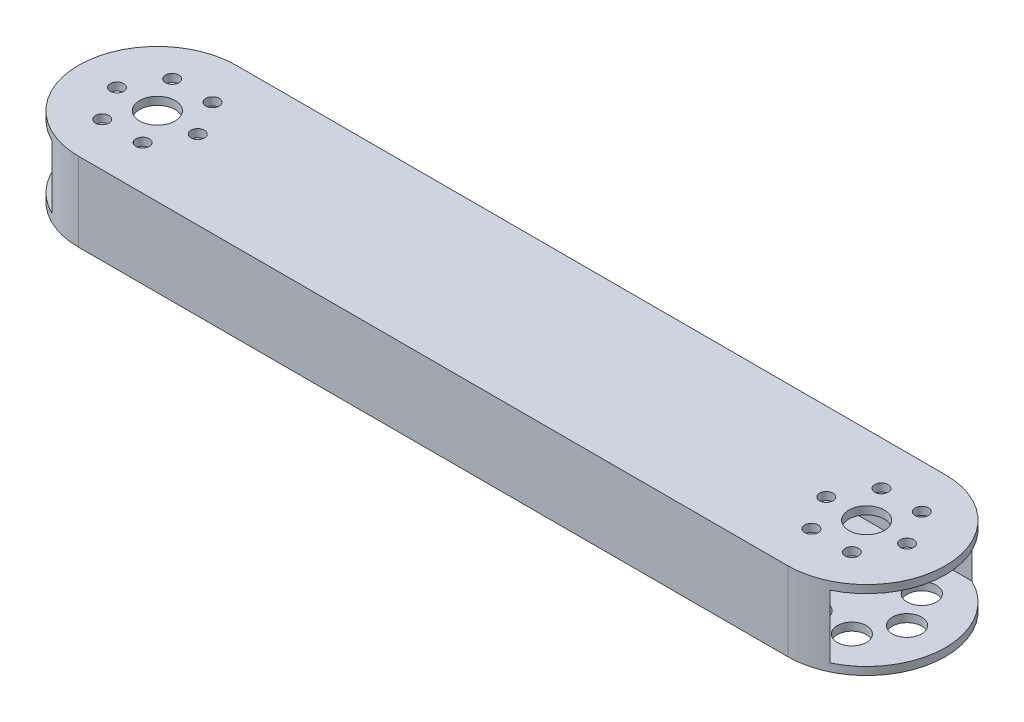
ISO-10303-21;
HEADER;
FILE_DESCRIPTION(('STEP AP214'),'2;1');
FILE_NAME('part.step','',(''),(''),'','','');
FILE_SCHEMA(('AUTOMOTIVE_DESIGN { 1 0 10303 214 1 1 1 1 }'));
ENDSEC;
DATA;
#1=APPLICATION_CONTEXT('core data for automotive mechanical design processes');
#2=APPLICATION_PROTOCOL_DEFINITION('international standard','automotive_design',2000,#1);
#3=PRODUCT_CONTEXT('',#1,'mechanical');
#4=PRODUCT('Part','Part','',(#3));
#5=PRODUCT_RELATED_PRODUCT_CATEGORY('part','',(#4));
#6=PRODUCT_DEFINITION_FORMATION('','',#4);
#7=PRODUCT_DEFINITION_CONTEXT('part definition',#1,'design');
#8=PRODUCT_DEFINITION('design','',#6,#7);
#9=PRODUCT_DEFINITION_SHAPE('','',#8);
#10=(LENGTH_UNIT() NAMED_UNIT(*) SI_UNIT(.MILLI.,.METRE.));
#11=(NAMED_UNIT(*) PLANE_ANGLE_UNIT() SI_UNIT($,.RADIAN.));
#12=(NAMED_UNIT(*) SI_UNIT($,.STERADIAN.) SOLID_ANGLE_UNIT());
#13=UNCERTAINTY_MEASURE_WITH_UNIT(LENGTH_MEASURE(1.E-05),#10,'distance_accuracy_value','');
#14=(GEOMETRIC_REPRESENTATION_CONTEXT(3) GLOBAL_UNCERTAINTY_ASSIGNED_CONTEXT((#13)) GLOBAL_UNIT_ASSIGNED_CONTEXT((#10,
#11,#12)) REPRESENTATION_CONTEXT('',''));
#15=CARTESIAN_POINT('',(0.,0.,0.));
#16=DIRECTION('',(0.,0.,1.));
#17=DIRECTION('',(1.,0.,0.));
#18=AXIS2_PLACEMENT_3D('',#15,#16,#17);
#19=CARTESIAN_POINT('',(220.,-10.,20.));
#20=DIRECTION('',(0.,1.,0.));
#21=DIRECTION('',(0.,0.,1.));
#22=AXIS2_PLACEMENT_3D('',#19,#20,#21);
#23=PLANE('',#22);
#24=CARTESIAN_POINT('',(14.875,-10.,-8.87676038879045));
#25=DIRECTION('',(0.,-1.,0.));
#26=DIRECTION('',(0.,0.,-1.));
#27=AXIS2_PLACEMENT_3D('',#24,#25,#26);
#28=CIRCLE('',#27,3.69999999999999);
#29=CARTESIAN_POINT('',(14.875,-10.,-12.5767603887905));
#30=VERTEX_POINT('',#29);
#31=EDGE_CURVE('E346',#30,#30,#28,.T.);
#32=ORIENTED_EDGE('',*,*,#31,.F.);
#33=EDGE_LOOP('',(#32));
#34=FACE_BOUND('',#33,.T.);
#35=CARTESIAN_POINT('',(25.125,-10.,-8.87676038879048));
#36=DIRECTION('',(0.,-1.,0.));
#37=DIRECTION('',(0.,0.,-1.));
#38=AXIS2_PLACEMENT_3D('',#35,#36,#37);
#39=CIRCLE('',#38,3.7);
#40=CARTESIAN_POINT('',(25.125,-10.,-12.5767603887905));
#41=VERTEX_POINT('',#40);
#42=EDGE_CURVE('E359',#41,#41,#39,.T.);
#43=ORIENTED_EDGE('',*,*,#42,.F.);
#44=EDGE_LOOP('',(#43));
#45=FACE_BOUND('',#44,.T.);
#46=CARTESIAN_POINT('',(30.25,-10.,0.));
#47=DIRECTION('',(0.,-1.,0.));
#48=DIRECTION('',(0.,0.,-1.));
#49=AXIS2_PLACEMENT_3D('',#46,#47,#48);
#50=CIRCLE('',#49,3.7);
#51=CARTESIAN_POINT('',(30.25,-10.,-3.7));
#52=VERTEX_POINT('',#51);
#53=EDGE_CURVE('E355',#52,#52,#50,.T.);
#54=ORIENTED_EDGE('',*,*,#53,.F.);
#55=EDGE_LOOP('',(#54));
#56=FACE_BOUND('',#55,.T.);
#57=CARTESIAN_POINT('',(194.875,-10.,8.87676038879051));
#58=DIRECTION('',(0.,-1.,0.));
#59=DIRECTION('',(0.,0.,-1.));
#60=AXIS2_PLACEMENT_3D('',#57,#58,#59);
#61=CIRCLE('',#60,3.70000000000007);
#62=CARTESIAN_POINT('',(194.875,-10.,5.17676038879044));
#63=VERTEX_POINT('',#62);
#64=EDGE_CURVE('E350',#63,#63,#61,.T.);
#65=ORIENTED_EDGE('',*,*,#64,.F.);
#66=EDGE_LOOP('',(#65));
#67=FACE_BOUND('',#66,.T.);
#68=CARTESIAN_POINT('',(205.125,-10.,8.87676038879048));
#69=DIRECTION('',(0.,-1.,0.));
#70=DIRECTION('',(0.,0.,-1.));
#71=AXIS2_PLACEMENT_3D('',#68,#69,#70);
#72=CIRCLE('',#71,3.70000000000004);
#73=CARTESIAN_POINT('',(205.125,-10.,5.17676038879044));
#74=VERTEX_POINT('',#73);
#75=EDGE_CURVE('E354',#74,#74,#72,.T.);
#76=ORIENTED_EDGE('',*,*,#75,.F.);
#77=EDGE_LOOP('',(#76));
#78=FACE_BOUND('',#77,.T.);
#79=CARTESIAN_POINT('',(210.25,-10.,0.));
#80=DIRECTION('',(0.,-1.,0.));
#81=DIRECTION('',(0.,0.,-1.));
#82=AXIS2_PLACEMENT_3D('',#79,#80,#81);
#83=CIRCLE('',#82,3.70000000000001);
#84=CARTESIAN_POINT('',(210.25,-10.,-3.7));
#85=VERTEX_POINT('',#84);
#86=EDGE_CURVE('E374',#85,#85,#83,.T.);
#87=ORIENTED_EDGE('',*,*,#86,.F.);
#88=EDGE_LOOP('',(#87));
#89=FACE_BOUND('',#88,.T.);
#90=CARTESIAN_POINT('',(205.125,-10.,-8.87676038879054));
#91=DIRECTION('',(0.,-1.,0.));
#92=DIRECTION('',(0.,0.,-1.));
#93=AXIS2_PLACEMENT_3D('',#90,#91,#92);
#94=CIRCLE('',#93,3.70000000000001);
#95=CARTESIAN_POINT('',(205.125,-10.,-12.5767603887905));
#96=VERTEX_POINT('',#95);
#97=EDGE_CURVE('E370',#96,#96,#94,.T.);
#98=ORIENTED_EDGE('',*,*,#97,.F.);
#99=EDGE_LOOP('',(#98));
#100=FACE_BOUND('',#99,.T.);
#101=CARTESIAN_POINT('',(194.875,-10.,-8.87676038879048));
#102=DIRECTION('',(0.,-1.,0.));
#103=DIRECTION('',(0.,0.,-1.));
#104=AXIS2_PLACEMENT_3D('',#101,#102,#103);
#105=CIRCLE('',#104,3.70000000000004);
#106=CARTESIAN_POINT('',(194.875,-10.,-12.5767603887905));
#107=VERTEX_POINT('',#106);
#108=EDGE_CURVE('E366',#107,#107,#105,.T.);
#109=ORIENTED_EDGE('',*,*,#108,.F.);
#110=EDGE_LOOP('',(#109));
#111=FACE_BOUND('',#110,.T.);
#112=CARTESIAN_POINT('',(14.875,-10.,8.87676038879054));
#113=DIRECTION('',(0.,-1.,0.));
#114=DIRECTION('',(0.,0.,-1.));
#115=AXIS2_PLACEMENT_3D('',#112,#113,#114);
#116=CIRCLE('',#115,3.70000000000001);
#117=CARTESIAN_POINT('',(14.875,-10.,5.17676038879053));
#118=VERTEX_POINT('',#117);
#119=EDGE_CURVE('E328',#118,#118,#116,.T.);
#120=ORIENTED_EDGE('',*,*,#119,.F.);
#121=EDGE_LOOP('',(#120));
#122=FACE_BOUND('',#121,.T.);
#123=CARTESIAN_POINT('',(25.125,-10.,8.87676038879051));
#124=DIRECTION('',(0.,-1.,0.));
#125=DIRECTION('',(0.,0.,-1.));
#126=AXIS2_PLACEMENT_3D('',#123,#124,#125);
#127=CIRCLE('',#126,3.7);
#128=CARTESIAN_POINT('',(25.125,-10.,5.17676038879051));
#129=VERTEX_POINT('',#128);
#130=EDGE_CURVE('E341',#129,#129,#127,.T.);
#131=ORIENTED_EDGE('',*,*,#130,.F.);
#132=EDGE_LOOP('',(#131));
#133=FACE_BOUND('',#132,.T.);
#134=CARTESIAN_POINT('',(9.75,-10.,0.));
#135=DIRECTION('',(0.,-1.,0.));
#136=DIRECTION('',(0.,0.,-1.));
#137=AXIS2_PLACEMENT_3D('',#134,#135,#136);
#138=CIRCLE('',#137,3.7);
#139=CARTESIAN_POINT('',(9.75,-10.,-3.69999999999995));
#140=VERTEX_POINT('',#139);
#141=EDGE_CURVE('E342',#140,#140,#138,.T.);
#142=ORIENTED_EDGE('',*,*,#141,.F.);
#143=EDGE_LOOP('',(#142));
#144=FACE_BOUND('',#143,.T.);
#145=CARTESIAN_POINT('',(189.75,-10.,0.));
#146=DIRECTION('',(0.,-1.,0.));
#147=DIRECTION('',(0.,0.,-1.));
#148=AXIS2_PLACEMENT_3D('',#145,#146,#147);
#149=CIRCLE('',#148,3.70000000000001);
#150=CARTESIAN_POINT('',(189.75,-10.,-3.70000000000001));
#151=VERTEX_POINT('',#150);
#152=EDGE_CURVE('E276',#151,#151,#149,.T.);
#153=ORIENTED_EDGE('',*,*,#152,.F.);
#154=EDGE_LOOP('',(#153));
#155=FACE_BOUND('',#154,.T.);
#156=DIRECTION('',(-1.,0.,0.));
#157=VECTOR('',#156,1.);
#158=CARTESIAN_POINT('',(220.,-10.,20.));
#159=LINE('',#158,#157);
#160=CARTESIAN_POINT('',(200.,-10.,20.));
#161=VERTEX_POINT('',#160);
#162=CARTESIAN_POINT('',(20.,-10.,20.));
#163=VERTEX_POINT('',#162);
#164=EDGE_CURVE('E251',#161,#163,#159,.T.);
#165=ORIENTED_EDGE('',*,*,#164,.T.);
#166=CARTESIAN_POINT('',(20.,-10.,0.));
#167=DIRECTION('',(0.,1.,0.));
#168=DIRECTION('',(0.,0.,1.));
#169=AXIS2_PLACEMENT_3D('',#166,#167,#168);
#170=CIRCLE('',#169,20.);
#171=CARTESIAN_POINT('',(20.,-10.,-20.));
#172=VERTEX_POINT('',#171);
#173=EDGE_CURVE('E233',#172,#163,#170,.T.);
#174=ORIENTED_EDGE('',*,*,#173,.F.);
#175=DIRECTION('',(-1.,0.,0.));
#176=VECTOR('',#175,1.);
#177=CARTESIAN_POINT('',(220.,-10.,-20.));
#178=LINE('',#177,#176);
#179=CARTESIAN_POINT('',(200.,-10.,-20.));
#180=VERTEX_POINT('',#179);
#181=EDGE_CURVE('E261',#180,#172,#178,.T.);
#182=ORIENTED_EDGE('',*,*,#181,.F.);
#183=CARTESIAN_POINT('',(200.,-10.,0.));
#184=DIRECTION('',(0.,1.,0.));
#185=DIRECTION('',(0.,0.,1.));
#186=AXIS2_PLACEMENT_3D('',#183,#184,#185);
#187=CIRCLE('',#186,20.);
#188=EDGE_CURVE('E259',#161,#180,#187,.T.);
#189=ORIENTED_EDGE('',*,*,#188,.F.);
#190=EDGE_LOOP('',(#165,#174,#182,#189));
#191=FACE_BOUND('',#190,.T.);
#192=ADVANCED_FACE('F165',(#34,#45,#56,#67,#78,#89,#100,#111,#122,#133,#144,#155,#191),#23,.F.);
#193=CARTESIAN_POINT('',(220.,10.,20.));
#194=DIRECTION('',(0.,1.,0.));
#195=DIRECTION('',(0.,0.,1.));
#196=AXIS2_PLACEMENT_3D('',#193,#194,#195);
#197=PLANE('',#196);
#198=CARTESIAN_POINT('',(20.,10.,0.));
#199=DIRECTION('',(0.,1.,0.));
#200=DIRECTION('',(0.,0.,1.));
#201=AXIS2_PLACEMENT_3D('',#198,#199,#200);
#202=CIRCLE('',#201,4.5);
#203=CARTESIAN_POINT('',(20.,10.,4.50000000000003));
#204=VERTEX_POINT('',#203);
#205=EDGE_CURVE('E322',#204,#204,#202,.T.);
#206=ORIENTED_EDGE('',*,*,#205,.F.);
#207=EDGE_LOOP('',(#206));
#208=FACE_BOUND('',#207,.T.);
#209=CARTESIAN_POINT('',(200.,10.,0.));
#210=DIRECTION('',(0.,1.,0.));
#211=DIRECTION('',(0.,0.,1.));
#212=AXIS2_PLACEMENT_3D('',#209,#210,#211);
#213=CIRCLE('',#212,4.49999999999999);
#214=CARTESIAN_POINT('',(200.,10.,4.5));
#215=VERTEX_POINT('',#214);
#216=EDGE_CURVE('E330',#215,#215,#213,.T.);
#217=ORIENTED_EDGE('',*,*,#216,.F.);
#218=EDGE_LOOP('',(#217));
#219=FACE_BOUND('',#218,.T.);
#220=CARTESIAN_POINT('',(194.875,10.,8.87676038879051));
#221=DIRECTION('',(0.,1.,0.));
#222=DIRECTION('',(0.,0.,1.));
#223=AXIS2_PLACEMENT_3D('',#220,#221,#222);
#224=CIRCLE('',#223,1.70000000000007);
#225=CARTESIAN_POINT('',(194.875,10.,10.5767603887906));
#226=VERTEX_POINT('',#225);
#227=EDGE_CURVE('E415',#226,#226,#224,.T.);
#228=ORIENTED_EDGE('',*,*,#227,.F.);
#229=EDGE_LOOP('',(#228));
#230=FACE_BOUND('',#229,.T.);
#231=CARTESIAN_POINT('',(14.875,10.,-8.87676038879045));
#232=DIRECTION('',(0.,1.,0.));
#233=DIRECTION('',(0.,0.,1.));
#234=AXIS2_PLACEMENT_3D('',#231,#232,#233);
#235=CIRCLE('',#234,1.7);
#236=CARTESIAN_POINT('',(14.875,10.,-7.17676038879046));
#237=VERTEX_POINT('',#236);
#238=EDGE_CURVE('E411',#237,#237,#235,.T.);
#239=ORIENTED_EDGE('',*,*,#238,.F.);
#240=EDGE_LOOP('',(#239));
#241=FACE_BOUND('',#240,.T.);
#242=CARTESIAN_POINT('',(25.125,10.,-8.87676038879048));
#243=DIRECTION('',(0.,1.,0.));
#244=DIRECTION('',(0.,0.,1.));
#245=AXIS2_PLACEMENT_3D('',#242,#243,#244);
#246=CIRCLE('',#245,1.7);
#247=CARTESIAN_POINT('',(25.125,10.,-7.17676038879048));
#248=VERTEX_POINT('',#247);
#249=EDGE_CURVE('E407',#248,#248,#246,.T.);
#250=ORIENTED_EDGE('',*,*,#249,.F.);
#251=EDGE_LOOP('',(#250));
#252=FACE_BOUND('',#251,.T.);
#253=CARTESIAN_POINT('',(30.25,10.,0.));
#254=DIRECTION('',(0.,1.,0.));
#255=DIRECTION('',(0.,0.,1.));
#256=AXIS2_PLACEMENT_3D('',#253,#254,#255);
#257=CIRCLE('',#256,1.7);
#258=CARTESIAN_POINT('',(30.25,10.,1.7));
#259=VERTEX_POINT('',#258);
#260=EDGE_CURVE('E399',#259,#259,#257,.T.);
#261=ORIENTED_EDGE('',*,*,#260,.F.);
#262=EDGE_LOOP('',(#261));
#263=FACE_BOUND('',#262,.T.);
#264=CARTESIAN_POINT('',(205.125,10.,-8.87676038879054));
#265=DIRECTION('',(0.,1.,0.));
#266=DIRECTION('',(0.,0.,1.));
#267=AXIS2_PLACEMENT_3D('',#264,#265,#266);
#268=CIRCLE('',#267,1.70000000000001);
#269=CARTESIAN_POINT('',(205.125,10.,-7.17676038879053));
#270=VERTEX_POINT('',#269);
#271=EDGE_CURVE('E431',#270,#270,#268,.T.);
#272=ORIENTED_EDGE('',*,*,#271,.F.);
#273=EDGE_LOOP('',(#272));
#274=FACE_BOUND('',#273,.T.);
#275=CARTESIAN_POINT('',(189.75,10.,0.));
#276=DIRECTION('',(0.,1.,0.));
#277=DIRECTION('',(0.,0.,1.));
#278=AXIS2_PLACEMENT_3D('',#275,#276,#277);
#279=CIRCLE('',#278,1.70000000000001);
#280=CARTESIAN_POINT('',(189.75,10.,1.70000000000002));
#281=VERTEX_POINT('',#280);
#282=EDGE_CURVE('E427',#281,#281,#279,.T.);
#283=ORIENTED_EDGE('',*,*,#282,.F.);
#284=EDGE_LOOP('',(#283));
#285=FACE_BOUND('',#284,.T.);
#286=CARTESIAN_POINT('',(210.25,10.,0.));
#287=DIRECTION('',(0.,1.,0.));
#288=DIRECTION('',(0.,0.,1.));
#289=AXIS2_PLACEMENT_3D('',#286,#287,#288);
#290=CIRCLE('',#289,1.70000000000001);
#291=CARTESIAN_POINT('',(210.25,10.,1.70000000000002));
#292=VERTEX_POINT('',#291);
#293=EDGE_CURVE('E423',#292,#292,#290,.T.);
#294=ORIENTED_EDGE('',*,*,#293,.F.);
#295=EDGE_LOOP('',(#294));
#296=FACE_BOUND('',#295,.T.);
#297=CARTESIAN_POINT('',(205.125,10.,8.87676038879048));
#298=DIRECTION('',(0.,1.,0.));
#299=DIRECTION('',(0.,0.,1.));
#300=AXIS2_PLACEMENT_3D('',#297,#298,#299);
#301=CIRCLE('',#300,1.70000000000004);
#302=CARTESIAN_POINT('',(205.125,10.,10.5767603887905));
#303=VERTEX_POINT('',#302);
#304=EDGE_CURVE('E419',#303,#303,#301,.T.);
#305=ORIENTED_EDGE('',*,*,#304,.F.);
#306=EDGE_LOOP('',(#305));
#307=FACE_BOUND('',#306,.T.);
#308=CARTESIAN_POINT('',(25.125,10.,8.87676038879051));
#309=DIRECTION('',(0.,1.,0.));
#310=DIRECTION('',(0.,0.,1.));
#311=AXIS2_PLACEMENT_3D('',#308,#309,#310);
#312=CIRCLE('',#311,1.7);
#313=CARTESIAN_POINT('',(25.125,10.,10.5767603887905));
#314=VERTEX_POINT('',#313);
#315=EDGE_CURVE('E395',#314,#314,#312,.T.);
#316=ORIENTED_EDGE('',*,*,#315,.F.);
#317=EDGE_LOOP('',(#316));
#318=FACE_BOUND('',#317,.T.);
#319=CARTESIAN_POINT('',(14.875,10.,8.87676038879054));
#320=DIRECTION('',(0.,1.,0.));
#321=DIRECTION('',(0.,0.,1.));
#322=AXIS2_PLACEMENT_3D('',#319,#320,#321);
#323=CIRCLE('',#322,1.7);
#324=CARTESIAN_POINT('',(14.875,10.,10.5767603887905));
#325=VERTEX_POINT('',#324);
#326=EDGE_CURVE('E400',#325,#325,#323,.T.);
#327=ORIENTED_EDGE('',*,*,#326,.F.);
#328=EDGE_LOOP('',(#327));
#329=FACE_BOUND('',#328,.T.);
#330=CARTESIAN_POINT('',(9.75,10.,0.));
#331=DIRECTION('',(0.,1.,0.));
#332=DIRECTION('',(0.,0.,1.));
#333=AXIS2_PLACEMENT_3D('',#330,#331,#332);
#334=CIRCLE('',#333,1.7);
#335=CARTESIAN_POINT('',(9.75,10.,1.70000000000005));
#336=VERTEX_POINT('',#335);
#337=EDGE_CURVE('E394',#336,#336,#334,.T.);
#338=ORIENTED_EDGE('',*,*,#337,.F.);
#339=EDGE_LOOP('',(#338));
#340=FACE_BOUND('',#339,.T.);
#341=CARTESIAN_POINT('',(194.875,10.,-8.87676038879048));
#342=DIRECTION('',(0.,1.,0.));
#343=DIRECTION('',(0.,0.,1.));
#344=AXIS2_PLACEMENT_3D('',#341,#342,#343);
#345=CIRCLE('',#344,1.70000000000004);
#346=CARTESIAN_POINT('',(194.875,10.,-7.17676038879044));
#347=VERTEX_POINT('',#346);
#348=EDGE_CURVE('E435',#347,#347,#345,.T.);
#349=ORIENTED_EDGE('',*,*,#348,.F.);
#350=EDGE_LOOP('',(#349));
#351=FACE_BOUND('',#350,.T.);
#352=CARTESIAN_POINT('',(20.,10.,0.));
#353=DIRECTION('',(0.,1.,0.));
#354=DIRECTION('',(0.,0.,1.));
#355=AXIS2_PLACEMENT_3D('',#352,#353,#354);
#356=CIRCLE('',#355,20.);
#357=CARTESIAN_POINT('',(20.,10.,-20.));
#358=VERTEX_POINT('',#357);
#359=CARTESIAN_POINT('',(20.,10.,20.));
#360=VERTEX_POINT('',#359);
#361=EDGE_CURVE('E246',#358,#360,#356,.T.);
#362=ORIENTED_EDGE('',*,*,#361,.T.);
#363=DIRECTION('',(-1.,0.,0.));
#364=VECTOR('',#363,1.);
#365=CARTESIAN_POINT('',(220.,10.,20.));
#366=LINE('',#365,#364);
#367=CARTESIAN_POINT('',(200.,10.,20.));
#368=VERTEX_POINT('',#367);
#369=EDGE_CURVE('E253',#368,#360,#366,.T.);
#370=ORIENTED_EDGE('',*,*,#369,.F.);
#371=CARTESIAN_POINT('',(200.,10.,0.));
#372=DIRECTION('',(0.,1.,0.));
#373=DIRECTION('',(0.,0.,1.));
#374=AXIS2_PLACEMENT_3D('',#371,#372,#373);
#375=CIRCLE('',#374,20.);
#376=CARTESIAN_POINT('',(200.,10.,-20.));
#377=VERTEX_POINT('',#376);
#378=EDGE_CURVE('E447',#368,#377,#375,.T.);
#379=ORIENTED_EDGE('',*,*,#378,.T.);
#380=DIRECTION('',(-1.,0.,0.));
#381=VECTOR('',#380,1.);
#382=CARTESIAN_POINT('',(220.,10.,-20.));
#383=LINE('',#382,#381);
#384=EDGE_CURVE('E267',#377,#358,#383,.T.);
#385=ORIENTED_EDGE('',*,*,#384,.T.);
#386=EDGE_LOOP('',(#362,#370,#379,#385));
#387=FACE_BOUND('',#386,.T.);
#388=ADVANCED_FACE('F530',(#208,#219,#230,#241,#252,#263,#274,#285,#296,#307,#318,#329,#340,
#351,#387),#197,.T.);
#389=CARTESIAN_POINT('',(220.,8.,0.));
#390=DIRECTION('',(0.,1.,0.));
#391=DIRECTION('',(0.,0.,1.));
#392=AXIS2_PLACEMENT_3D('',#389,#390,#391);
#393=PLANE('',#392);
#394=CARTESIAN_POINT('',(20.,8.,0.));
#395=DIRECTION('',(0.,1.,0.));
#396=DIRECTION('',(0.,0.,1.));
#397=AXIS2_PLACEMENT_3D('',#394,#395,#396);
#398=CIRCLE('',#397,4.5);
#399=CARTESIAN_POINT('',(20.,8.,4.50000000000003));
#400=VERTEX_POINT('',#399);
#401=EDGE_CURVE('E169',#400,#400,#398,.T.);
#402=ORIENTED_EDGE('',*,*,#401,.T.);
#403=EDGE_LOOP('',(#402));
#404=FACE_BOUND('',#403,.T.);
#405=CARTESIAN_POINT('',(200.,8.,0.));
#406=DIRECTION('',(0.,1.,0.));
#407=DIRECTION('',(0.,0.,1.));
#408=AXIS2_PLACEMENT_3D('',#405,#406,#407);
#409=CIRCLE('',#408,4.49999999999999);
#410=CARTESIAN_POINT('',(200.,8.,4.5));
#411=VERTEX_POINT('',#410);
#412=EDGE_CURVE('E319',#411,#411,#409,.T.);
#413=ORIENTED_EDGE('',*,*,#412,.T.);
#414=EDGE_LOOP('',(#413));
#415=FACE_BOUND('',#414,.T.);
#416=CARTESIAN_POINT('',(194.875,8.,8.87676038879051));
#417=DIRECTION('',(0.,1.,0.));
#418=DIRECTION('',(0.,0.,1.));
#419=AXIS2_PLACEMENT_3D('',#416,#417,#418);
#420=CIRCLE('',#419,1.70000000000007);
#421=CARTESIAN_POINT('',(194.875,8.,10.5767603887906));
#422=VERTEX_POINT('',#421);
#423=EDGE_CURVE('E509',#422,#422,#420,.T.);
#424=ORIENTED_EDGE('',*,*,#423,.T.);
#425=EDGE_LOOP('',(#424));
#426=FACE_BOUND('',#425,.T.);
#427=CARTESIAN_POINT('',(14.875,8.,-8.87676038879045));
#428=DIRECTION('',(0.,1.,0.));
#429=DIRECTION('',(0.,0.,1.));
#430=AXIS2_PLACEMENT_3D('',#427,#428,#429);
#431=CIRCLE('',#430,1.7);
#432=CARTESIAN_POINT('',(14.875,8.,-7.17676038879046));
#433=VERTEX_POINT('',#432);
#434=EDGE_CURVE('E505',#433,#433,#431,.T.);
#435=ORIENTED_EDGE('',*,*,#434,.T.);
#436=EDGE_LOOP('',(#435));
#437=FACE_BOUND('',#436,.T.);
#438=CARTESIAN_POINT('',(25.125,8.,-8.87676038879048));
#439=DIRECTION('',(0.,1.,0.));
#440=DIRECTION('',(0.,0.,1.));
#441=AXIS2_PLACEMENT_3D('',#438,#439,#440);
#442=CIRCLE('',#441,1.7);
#443=CARTESIAN_POINT('',(25.125,8.,-7.17676038879048));
#444=VERTEX_POINT('',#443);
#445=EDGE_CURVE('E501',#444,#444,#442,.T.);
#446=ORIENTED_EDGE('',*,*,#445,.T.);
#447=EDGE_LOOP('',(#446));
#448=FACE_BOUND('',#447,.T.);
#449=CARTESIAN_POINT('',(30.25,8.,0.));
#450=DIRECTION('',(0.,1.,0.));
#451=DIRECTION('',(0.,0.,1.));
#452=AXIS2_PLACEMENT_3D('',#449,#450,#451);
#453=CIRCLE('',#452,1.7);
#454=CARTESIAN_POINT('',(30.25,8.,1.7));
#455=VERTEX_POINT('',#454);
#456=EDGE_CURVE('E497',#455,#455,#453,.T.);
#457=ORIENTED_EDGE('',*,*,#456,.T.);
#458=EDGE_LOOP('',(#457));
#459=FACE_BOUND('',#458,.T.);
#460=CARTESIAN_POINT('',(205.125,8.,-8.87676038879054));
#461=DIRECTION('',(0.,1.,0.));
#462=DIRECTION('',(0.,0.,1.));
#463=AXIS2_PLACEMENT_3D('',#460,#461,#462);
#464=CIRCLE('',#463,1.70000000000001);
#465=CARTESIAN_POINT('',(205.125,8.,-7.17676038879053));
#466=VERTEX_POINT('',#465);
#467=EDGE_CURVE('E493',#466,#466,#464,.T.);
#468=ORIENTED_EDGE('',*,*,#467,.T.);
#469=EDGE_LOOP('',(#468));
#470=FACE_BOUND('',#469,.T.);
#471=CARTESIAN_POINT('',(189.75,8.,0.));
#472=DIRECTION('',(0.,1.,0.));
#473=DIRECTION('',(0.,0.,1.));
#474=AXIS2_PLACEMENT_3D('',#471,#472,#473);
#475=CIRCLE('',#474,1.70000000000001);
#476=CARTESIAN_POINT('',(189.75,8.,1.70000000000002));
#477=VERTEX_POINT('',#476);
#478=EDGE_CURVE('E489',#477,#477,#475,.T.);
#479=ORIENTED_EDGE('',*,*,#478,.T.);
#480=EDGE_LOOP('',(#479));
#481=FACE_BOUND('',#480,.T.);
#482=CARTESIAN_POINT('',(210.25,8.,0.));
#483=DIRECTION('',(0.,1.,0.));
#484=DIRECTION('',(0.,0.,1.));
#485=AXIS2_PLACEMENT_3D('',#482,#483,#484);
#486=CIRCLE('',#485,1.70000000000001);
#487=CARTESIAN_POINT('',(210.25,8.,1.70000000000002));
#488=VERTEX_POINT('',#487);
#489=EDGE_CURVE('E485',#488,#488,#486,.T.);
#490=ORIENTED_EDGE('',*,*,#489,.T.);
#491=EDGE_LOOP('',(#490));
#492=FACE_BOUND('',#491,.T.);
#493=CARTESIAN_POINT('',(205.125,8.,8.87676038879048));
#494=DIRECTION('',(0.,1.,0.));
#495=DIRECTION('',(0.,0.,1.));
#496=AXIS2_PLACEMENT_3D('',#493,#494,#495);
#497=CIRCLE('',#496,1.70000000000004);
#498=CARTESIAN_POINT('',(205.125,8.,10.5767603887905));
#499=VERTEX_POINT('',#498);
#500=EDGE_CURVE('E481',#499,#499,#497,.T.);
#501=ORIENTED_EDGE('',*,*,#500,.T.);
#502=EDGE_LOOP('',(#501));
#503=FACE_BOUND('',#502,.T.);
#504=CARTESIAN_POINT('',(25.125,8.,8.87676038879051));
#505=DIRECTION('',(0.,1.,0.));
#506=DIRECTION('',(0.,0.,1.));
#507=AXIS2_PLACEMENT_3D('',#504,#505,#506);
#508=CIRCLE('',#507,1.7);
#509=CARTESIAN_POINT('',(25.125,8.,10.5767603887905));
#510=VERTEX_POINT('',#509);
#511=EDGE_CURVE('E477',#510,#510,#508,.T.);
#512=ORIENTED_EDGE('',*,*,#511,.T.);
#513=EDGE_LOOP('',(#512));
#514=FACE_BOUND('',#513,.T.);
#515=CARTESIAN_POINT('',(14.875,8.,8.87676038879054));
#516=DIRECTION('',(0.,1.,0.));
#517=DIRECTION('',(0.,0.,1.));
#518=AXIS2_PLACEMENT_3D('',#515,#516,#517);
#519=CIRCLE('',#518,1.7);
#520=CARTESIAN_POINT('',(14.875,8.,10.5767603887905));
#521=VERTEX_POINT('',#520);
#522=EDGE_CURVE('E473',#521,#521,#519,.T.);
#523=ORIENTED_EDGE('',*,*,#522,.T.);
#524=EDGE_LOOP('',(#523));
#525=FACE_BOUND('',#524,.T.);
#526=CARTESIAN_POINT('',(9.75,8.,0.));
#527=DIRECTION('',(0.,1.,0.));
#528=DIRECTION('',(0.,0.,1.));
#529=AXIS2_PLACEMENT_3D('',#526,#527,#528);
#530=CIRCLE('',#529,1.7);
#531=CARTESIAN_POINT('',(9.75,8.,1.70000000000005));
#532=VERTEX_POINT('',#531);
#533=EDGE_CURVE('E469',#532,#532,#530,.T.);
#534=ORIENTED_EDGE('',*,*,#533,.T.);
#535=EDGE_LOOP('',(#534));
#536=FACE_BOUND('',#535,.T.);
#537=CARTESIAN_POINT('',(194.875,8.,-8.87676038879048));
#538=DIRECTION('',(0.,1.,0.));
#539=DIRECTION('',(0.,0.,1.));
#540=AXIS2_PLACEMENT_3D('',#537,#538,#539);
#541=CIRCLE('',#540,1.70000000000004);
#542=CARTESIAN_POINT('',(194.875,8.,-7.17676038879044));
#543=VERTEX_POINT('',#542);
#544=EDGE_CURVE('E465',#543,#543,#541,.T.);
#545=ORIENTED_EDGE('',*,*,#544,.T.);
#546=EDGE_LOOP('',(#545));
#547=FACE_BOUND('',#546,.T.);
#548=DIRECTION('',(-1.,0.,0.));
#549=VECTOR('',#548,1.);
#550=CARTESIAN_POINT('',(220.,8.,18.));
#551=LINE('',#550,#549);
#552=CARTESIAN_POINT('',(208.717797887081,8.,18.));
#553=VERTEX_POINT('',#552);
#554=CARTESIAN_POINT('',(11.2822021129186,8.,18.));
#555=VERTEX_POINT('',#554);
#556=EDGE_CURVE('E522',#553,#555,#551,.T.);
#557=ORIENTED_EDGE('',*,*,#556,.T.);
#558=CARTESIAN_POINT('',(20.,8.,0.));
#559=DIRECTION('',(0.,1.,0.));
#560=DIRECTION('',(0.,0.,1.));
#561=AXIS2_PLACEMENT_3D('',#558,#559,#560);
#562=CIRCLE('',#561,20.);
#563=CARTESIAN_POINT('',(11.2822021129187,8.,-18.));
#564=VERTEX_POINT('',#563);
#565=EDGE_CURVE('E457',#564,#555,#562,.T.);
#566=ORIENTED_EDGE('',*,*,#565,.F.);
#567=DIRECTION('',(-1.,0.,0.));
#568=VECTOR('',#567,1.);
#569=CARTESIAN_POINT('',(220.,8.,-18.));
#570=LINE('',#569,#568);
#571=CARTESIAN_POINT('',(208.717797887081,8.,-18.));
#572=VERTEX_POINT('',#571);
#573=EDGE_CURVE('E513',#572,#564,#570,.T.);
#574=ORIENTED_EDGE('',*,*,#573,.F.);
#575=CARTESIAN_POINT('',(200.,8.,0.));
#576=DIRECTION('',(0.,1.,0.));
#577=DIRECTION('',(0.,0.,1.));
#578=AXIS2_PLACEMENT_3D('',#575,#576,#577);
#579=CIRCLE('',#578,20.);
#580=EDGE_CURVE('E462',#553,#572,#579,.T.);
#581=ORIENTED_EDGE('',*,*,#580,.F.);
#582=EDGE_LOOP('',(#557,#566,#574,#581));
#583=FACE_BOUND('',#582,.T.);
#584=ADVANCED_FACE('F547',(#404,#415,#426,#437,#448,#459,#470,#481,#492,#503,#514,#525,#536,
#547,#583),#393,.F.);
#585=CARTESIAN_POINT('',(220.,0.,18.));
#586=DIRECTION('',(0.,0.,-1.));
#587=DIRECTION('',(-1.,0.,0.));
#588=AXIS2_PLACEMENT_3D('',#585,#586,#587);
#589=PLANE('',#588);
#590=DIRECTION('',(-1.,0.,0.));
#591=VECTOR('',#590,1.);
#592=CARTESIAN_POINT('',(220.,-8.,18.));
#593=LINE('',#592,#591);
#594=CARTESIAN_POINT('',(208.717797887081,-8.,18.));
#595=VERTEX_POINT('',#594);
#596=CARTESIAN_POINT('',(11.2822021129186,-8.,18.));
#597=VERTEX_POINT('',#596);
#598=EDGE_CURVE('E518',#595,#597,#593,.T.);
#599=ORIENTED_EDGE('',*,*,#598,.T.);
#600=DIRECTION('',(0.,1.,0.));
#601=VECTOR('',#600,1.);
#602=CARTESIAN_POINT('',(11.2822021129186,-10.,18.));
#603=LINE('',#602,#601);
#604=EDGE_CURVE('E390',#597,#555,#603,.T.);
#605=ORIENTED_EDGE('',*,*,#604,.T.);
#606=ORIENTED_EDGE('',*,*,#556,.F.);
#607=DIRECTION('',(0.,1.,0.));
#608=VECTOR('',#607,1.);
#609=CARTESIAN_POINT('',(208.717797887081,-10.,18.));
#610=LINE('',#609,#608);
#611=EDGE_CURVE('E190',#553,#595,#610,.F.);
#612=ORIENTED_EDGE('',*,*,#611,.T.);
#613=EDGE_LOOP('',(#599,#605,#606,#612));
#614=FACE_BOUND('',#613,.T.);
#615=ADVANCED_FACE('F550',(#614),#589,.T.);
#616=CARTESIAN_POINT('',(220.,-8.,0.));
#617=DIRECTION('',(0.,1.,0.));
#618=DIRECTION('',(0.,0.,1.));
#619=AXIS2_PLACEMENT_3D('',#616,#617,#618);
#620=PLANE('',#619);
#621=CARTESIAN_POINT('',(14.875,-8.,-8.87676038879045));
#622=DIRECTION('',(0.,1.,0.));
#623=DIRECTION('',(0.,0.,1.));
#624=AXIS2_PLACEMENT_3D('',#621,#622,#623);
#625=CIRCLE('',#624,3.69999999999999);
#626=CARTESIAN_POINT('',(14.875,-8.,-5.17676038879046));
#627=VERTEX_POINT('',#626);
#628=EDGE_CURVE('E316',#627,#627,#625,.T.);
#629=ORIENTED_EDGE('',*,*,#628,.F.);
#630=EDGE_LOOP('',(#629));
#631=FACE_BOUND('',#630,.T.);
#632=CARTESIAN_POINT('',(25.125,-8.,-8.87676038879048));
#633=DIRECTION('',(0.,1.,0.));
#634=DIRECTION('',(0.,0.,1.));
#635=AXIS2_PLACEMENT_3D('',#632,#633,#634);
#636=CIRCLE('',#635,3.7);
#637=CARTESIAN_POINT('',(25.125,-8.,-5.17676038879048));
#638=VERTEX_POINT('',#637);
#639=EDGE_CURVE('E312',#638,#638,#636,.T.);
#640=ORIENTED_EDGE('',*,*,#639,.F.);
#641=EDGE_LOOP('',(#640));
#642=FACE_BOUND('',#641,.T.);
#643=CARTESIAN_POINT('',(30.25,-8.,0.));
#644=DIRECTION('',(0.,1.,0.));
#645=DIRECTION('',(0.,0.,1.));
#646=AXIS2_PLACEMENT_3D('',#643,#644,#645);
#647=CIRCLE('',#646,3.7);
#648=CARTESIAN_POINT('',(30.25,-8.,3.7));
#649=VERTEX_POINT('',#648);
#650=EDGE_CURVE('E308',#649,#649,#647,.T.);
#651=ORIENTED_EDGE('',*,*,#650,.F.);
#652=EDGE_LOOP('',(#651));
#653=FACE_BOUND('',#652,.T.);
#654=CARTESIAN_POINT('',(194.875,-8.,8.87676038879051));
#655=DIRECTION('',(0.,1.,0.));
#656=DIRECTION('',(0.,0.,1.));
#657=AXIS2_PLACEMENT_3D('',#654,#655,#656);
#658=CIRCLE('',#657,3.70000000000007);
#659=CARTESIAN_POINT('',(194.875,-8.,12.5767603887906));
#660=VERTEX_POINT('',#659);
#661=EDGE_CURVE('E304',#660,#660,#658,.T.);
#662=ORIENTED_EDGE('',*,*,#661,.F.);
#663=EDGE_LOOP('',(#662));
#664=FACE_BOUND('',#663,.T.);
#665=CARTESIAN_POINT('',(205.125,-8.,8.87676038879048));
#666=DIRECTION('',(0.,1.,0.));
#667=DIRECTION('',(0.,0.,1.));
#668=AXIS2_PLACEMENT_3D('',#665,#666,#667);
#669=CIRCLE('',#668,3.70000000000004);
#670=CARTESIAN_POINT('',(205.125,-8.,12.5767603887905));
#671=VERTEX_POINT('',#670);
#672=EDGE_CURVE('E300',#671,#671,#669,.T.);
#673=ORIENTED_EDGE('',*,*,#672,.F.);
#674=EDGE_LOOP('',(#673));
#675=FACE_BOUND('',#674,.T.);
#676=CARTESIAN_POINT('',(210.25,-8.,0.));
#677=DIRECTION('',(0.,1.,0.));
#678=DIRECTION('',(0.,0.,1.));
#679=AXIS2_PLACEMENT_3D('',#676,#677,#678);
#680=CIRCLE('',#679,3.70000000000001);
#681=CARTESIAN_POINT('',(210.25,-8.,3.70000000000002));
#682=VERTEX_POINT('',#681);
#683=EDGE_CURVE('E296',#682,#682,#680,.T.);
#684=ORIENTED_EDGE('',*,*,#683,.F.);
#685=EDGE_LOOP('',(#684));
#686=FACE_BOUND('',#685,.T.);
#687=CARTESIAN_POINT('',(205.125,-8.,-8.87676038879054));
#688=DIRECTION('',(0.,1.,0.));
#689=DIRECTION('',(0.,0.,1.));
#690=AXIS2_PLACEMENT_3D('',#687,#688,#689);
#691=CIRCLE('',#690,3.70000000000001);
#692=CARTESIAN_POINT('',(205.125,-8.,-5.17676038879053));
#693=VERTEX_POINT('',#692);
#694=EDGE_CURVE('E292',#693,#693,#691,.T.);
#695=ORIENTED_EDGE('',*,*,#694,.F.);
#696=EDGE_LOOP('',(#695));
#697=FACE_BOUND('',#696,.T.);
#698=CARTESIAN_POINT('',(194.875,-8.,-8.87676038879048));
#699=DIRECTION('',(0.,1.,0.));
#700=DIRECTION('',(0.,0.,1.));
#701=AXIS2_PLACEMENT_3D('',#698,#699,#700);
#702=CIRCLE('',#701,3.70000000000004);
#703=CARTESIAN_POINT('',(194.875,-8.,-5.17676038879044));
#704=VERTEX_POINT('',#703);
#705=EDGE_CURVE('E288',#704,#704,#702,.T.);
#706=ORIENTED_EDGE('',*,*,#705,.F.);
#707=EDGE_LOOP('',(#706));
#708=FACE_BOUND('',#707,.T.);
#709=CARTESIAN_POINT('',(14.875,-8.,8.87676038879054));
#710=DIRECTION('',(0.,1.,0.));
#711=DIRECTION('',(0.,0.,1.));
#712=AXIS2_PLACEMENT_3D('',#709,#710,#711);
#713=CIRCLE('',#712,3.70000000000001);
#714=CARTESIAN_POINT('',(14.875,-8.,12.5767603887905));
#715=VERTEX_POINT('',#714);
#716=EDGE_CURVE('E284',#715,#715,#713,.T.);
#717=ORIENTED_EDGE('',*,*,#716,.F.);
#718=EDGE_LOOP('',(#717));
#719=FACE_BOUND('',#718,.T.);
#720=CARTESIAN_POINT('',(25.125,-8.,8.87676038879051));
#721=DIRECTION('',(0.,1.,0.));
#722=DIRECTION('',(0.,0.,1.));
#723=AXIS2_PLACEMENT_3D('',#720,#721,#722);
#724=CIRCLE('',#723,3.7);
#725=CARTESIAN_POINT('',(25.125,-8.,12.5767603887905));
#726=VERTEX_POINT('',#725);
#727=EDGE_CURVE('E280',#726,#726,#724,.T.);
#728=ORIENTED_EDGE('',*,*,#727,.F.);
#729=EDGE_LOOP('',(#728));
#730=FACE_BOUND('',#729,.T.);
#731=CARTESIAN_POINT('',(9.75,-8.,0.));
#732=DIRECTION('',(0.,1.,0.));
#733=DIRECTION('',(0.,0.,1.));
#734=AXIS2_PLACEMENT_3D('',#731,#732,#733);
#735=CIRCLE('',#734,3.7);
#736=CARTESIAN_POINT('',(9.75,-8.,3.70000000000005));
#737=VERTEX_POINT('',#736);
#738=EDGE_CURVE('E275',#737,#737,#735,.T.);
#739=ORIENTED_EDGE('',*,*,#738,.F.);
#740=EDGE_LOOP('',(#739));
#741=FACE_BOUND('',#740,.T.);
#742=CARTESIAN_POINT('',(189.75,-8.,0.));
#743=DIRECTION('',(0.,1.,0.));
#744=DIRECTION('',(0.,0.,1.));
#745=AXIS2_PLACEMENT_3D('',#742,#743,#744);
#746=CIRCLE('',#745,3.70000000000001);
#747=CARTESIAN_POINT('',(189.75,-8.,3.70000000000001));
#748=VERTEX_POINT('',#747);
#749=EDGE_CURVE('E271',#748,#748,#746,.T.);
#750=ORIENTED_EDGE('',*,*,#749,.F.);
#751=EDGE_LOOP('',(#750));
#752=FACE_BOUND('',#751,.T.);
#753=CARTESIAN_POINT('',(20.,-8.,0.));
#754=DIRECTION('',(0.,1.,0.));
#755=DIRECTION('',(0.,0.,1.));
#756=AXIS2_PLACEMENT_3D('',#753,#754,#755);
#757=CIRCLE('',#756,20.);
#758=CARTESIAN_POINT('',(11.2822021129187,-8.,-18.));
#759=VERTEX_POINT('',#758);
#760=EDGE_CURVE('E444',#759,#597,#757,.T.);
#761=ORIENTED_EDGE('',*,*,#760,.T.);
#762=ORIENTED_EDGE('',*,*,#598,.F.);
#763=CARTESIAN_POINT('',(200.,-8.,0.));
#764=DIRECTION('',(0.,1.,0.));
#765=DIRECTION('',(0.,0.,1.));
#766=AXIS2_PLACEMENT_3D('',#763,#764,#765);
#767=CIRCLE('',#766,20.);
#768=CARTESIAN_POINT('',(208.717797887081,-8.,-18.));
#769=VERTEX_POINT('',#768);
#770=EDGE_CURVE('E12',#595,#769,#767,.T.);
#771=ORIENTED_EDGE('',*,*,#770,.T.);
#772=DIRECTION('',(-1.,0.,0.));
#773=VECTOR('',#772,1.);
#774=CARTESIAN_POINT('',(220.,-8.,-18.));
#775=LINE('',#774,#773);
#776=EDGE_CURVE('E182',#769,#759,#775,.T.);
#777=ORIENTED_EDGE('',*,*,#776,.T.);
#778=EDGE_LOOP('',(#761,#762,#771,#777));
#779=FACE_BOUND('',#778,.T.);
#780=ADVANCED_FACE('F552',(#631,#642,#653,#664,#675,#686,#697,#708,#719,#730,#741,#752,#779),
#620,.T.);
#781=CARTESIAN_POINT('',(220.,0.,-18.));
#782=DIRECTION('',(0.,0.,-1.));
#783=DIRECTION('',(0.,1.,0.));
#784=AXIS2_PLACEMENT_3D('',#781,#782,#783);
#785=PLANE('',#784);
#786=DIRECTION('',(0.,1.,0.));
#787=VECTOR('',#786,1.);
#788=CARTESIAN_POINT('',(208.717797887081,-10.,-18.));
#789=LINE('',#788,#787);
#790=EDGE_CURVE('E255',#572,#769,#789,.F.);
#791=ORIENTED_EDGE('',*,*,#790,.F.);
#792=ORIENTED_EDGE('',*,*,#573,.T.);
#793=DIRECTION('',(0.,1.,0.));
#794=VECTOR('',#793,1.);
#795=CARTESIAN_POINT('',(11.2822021129187,-10.,-18.));
#796=LINE('',#795,#794);
#797=EDGE_CURVE('E175',#759,#564,#796,.T.);
#798=ORIENTED_EDGE('',*,*,#797,.F.);
#799=ORIENTED_EDGE('',*,*,#776,.F.);
#800=EDGE_LOOP('',(#791,#792,#798,#799));
#801=FACE_BOUND('',#800,.T.);
#802=ADVANCED_FACE('F544',(#801),#785,.F.);
#803=CARTESIAN_POINT('',(220.,10.,20.));
#804=DIRECTION('',(0.,0.,-1.));
#805=DIRECTION('',(0.,1.,0.));
#806=AXIS2_PLACEMENT_3D('',#803,#804,#805);
#807=PLANE('',#806);
#808=DIRECTION('',(0.,1.,0.));
#809=VECTOR('',#808,1.);
#810=CARTESIAN_POINT('',(20.,-10.,20.));
#811=LINE('',#810,#809);
#812=EDGE_CURVE('E238',#163,#360,#811,.T.);
#813=ORIENTED_EDGE('',*,*,#812,.F.);
#814=ORIENTED_EDGE('',*,*,#164,.F.);
#815=DIRECTION('',(0.,1.,0.));
#816=VECTOR('',#815,1.);
#817=CARTESIAN_POINT('',(200.,-10.,20.));
#818=LINE('',#817,#816);
#819=EDGE_CURVE('E441',#161,#368,#818,.T.);
#820=ORIENTED_EDGE('',*,*,#819,.T.);
#821=ORIENTED_EDGE('',*,*,#369,.T.);
#822=EDGE_LOOP('',(#813,#814,#820,#821));
#823=FACE_BOUND('',#822,.T.);
#824=ADVANCED_FACE('F167',(#823),#807,.F.);
#825=CARTESIAN_POINT('',(220.,10.,-20.));
#826=DIRECTION('',(0.,0.,-1.));
#827=DIRECTION('',(0.,1.,0.));
#828=AXIS2_PLACEMENT_3D('',#825,#826,#827);
#829=PLANE('',#828);
#830=DIRECTION('',(0.,1.,0.));
#831=VECTOR('',#830,1.);
#832=CARTESIAN_POINT('',(200.,-10.,-20.));
#833=LINE('',#832,#831);
#834=EDGE_CURVE('E256',#180,#377,#833,.T.);
#835=ORIENTED_EDGE('',*,*,#834,.F.);
#836=ORIENTED_EDGE('',*,*,#181,.T.);
#837=DIRECTION('',(0.,1.,0.));
#838=VECTOR('',#837,1.);
#839=CARTESIAN_POINT('',(20.,-10.,-20.));
#840=LINE('',#839,#838);
#841=EDGE_CURVE('E241',#172,#358,#840,.T.);
#842=ORIENTED_EDGE('',*,*,#841,.T.);
#843=ORIENTED_EDGE('',*,*,#384,.F.);
#844=EDGE_LOOP('',(#835,#836,#842,#843));
#845=FACE_BOUND('',#844,.T.);
#846=ADVANCED_FACE('F533',(#845),#829,.T.);
#847=CARTESIAN_POINT('',(20.,-10.,0.));
#848=DIRECTION('',(0.,1.,0.));
#849=DIRECTION('',(0.,0.,1.));
#850=AXIS2_PLACEMENT_3D('',#847,#848,#849);
#851=CYLINDRICAL_SURFACE('',#850,20.);
#852=ORIENTED_EDGE('',*,*,#812,.T.);
#853=ORIENTED_EDGE('',*,*,#361,.F.);
#854=ORIENTED_EDGE('',*,*,#841,.F.);
#855=ORIENTED_EDGE('',*,*,#173,.T.);
#856=EDGE_LOOP('',(#852,#853,#854,#855));
#857=FACE_BOUND('',#856,.T.);
#858=ORIENTED_EDGE('',*,*,#565,.T.);
#859=ORIENTED_EDGE('',*,*,#604,.F.);
#860=ORIENTED_EDGE('',*,*,#760,.F.);
#861=ORIENTED_EDGE('',*,*,#797,.T.);
#862=EDGE_LOOP('',(#858,#859,#860,#861));
#863=FACE_BOUND('',#862,.T.);
#864=ADVANCED_FACE('F235',(#857,#863),#851,.T.);
#865=CARTESIAN_POINT('',(200.,-10.,0.));
#866=DIRECTION('',(0.,1.,0.));
#867=DIRECTION('',(0.,0.,1.));
#868=AXIS2_PLACEMENT_3D('',#865,#866,#867);
#869=CYLINDRICAL_SURFACE('',#868,20.);
#870=ORIENTED_EDGE('',*,*,#834,.T.);
#871=ORIENTED_EDGE('',*,*,#378,.F.);
#872=ORIENTED_EDGE('',*,*,#819,.F.);
#873=ORIENTED_EDGE('',*,*,#188,.T.);
#874=EDGE_LOOP('',(#870,#871,#872,#873));
#875=FACE_BOUND('',#874,.T.);
#876=ORIENTED_EDGE('',*,*,#580,.T.);
#877=ORIENTED_EDGE('',*,*,#790,.T.);
#878=ORIENTED_EDGE('',*,*,#770,.F.);
#879=ORIENTED_EDGE('',*,*,#611,.F.);
#880=EDGE_LOOP('',(#876,#877,#878,#879));
#881=FACE_BOUND('',#880,.T.);
#882=ADVANCED_FACE('F535',(#875,#881),#869,.T.);
#883=CARTESIAN_POINT('',(194.875,-10.,-8.87676038879048));
#884=DIRECTION('',(0.,1.,0.));
#885=DIRECTION('',(0.,0.,1.));
#886=AXIS2_PLACEMENT_3D('',#883,#884,#885);
#887=CYLINDRICAL_SURFACE('',#886,1.70000000000004);
#888=ORIENTED_EDGE('',*,*,#348,.T.);
#889=EDGE_LOOP('',(#888));
#890=FACE_BOUND('',#889,.T.);
#891=ORIENTED_EDGE('',*,*,#544,.F.);
#892=EDGE_LOOP('',(#891));
#893=FACE_BOUND('',#892,.T.);
#894=ADVANCED_FACE('F537',(#890,#893),#887,.F.);
#895=CARTESIAN_POINT('',(9.75,-10.,0.));
#896=DIRECTION('',(0.,1.,0.));
#897=DIRECTION('',(0.,0.,1.));
#898=AXIS2_PLACEMENT_3D('',#895,#896,#897);
#899=CYLINDRICAL_SURFACE('',#898,1.7);
#900=ORIENTED_EDGE('',*,*,#337,.T.);
#901=EDGE_LOOP('',(#900));
#902=FACE_BOUND('',#901,.T.);
#903=ORIENTED_EDGE('',*,*,#533,.F.);
#904=EDGE_LOOP('',(#903));
#905=FACE_BOUND('',#904,.T.);
#906=ADVANCED_FACE('F610',(#902,#905),#899,.F.);
#907=CARTESIAN_POINT('',(14.875,-10.,8.87676038879054));
#908=DIRECTION('',(0.,1.,0.));
#909=DIRECTION('',(0.,0.,1.));
#910=AXIS2_PLACEMENT_3D('',#907,#908,#909);
#911=CYLINDRICAL_SURFACE('',#910,1.7);
#912=ORIENTED_EDGE('',*,*,#326,.T.);
#913=EDGE_LOOP('',(#912));
#914=FACE_BOUND('',#913,.T.);
#915=ORIENTED_EDGE('',*,*,#522,.F.);
#916=EDGE_LOOP('',(#915));
#917=FACE_BOUND('',#916,.T.);
#918=ADVANCED_FACE('F616',(#914,#917),#911,.F.);
#919=CARTESIAN_POINT('',(25.125,-10.,8.87676038879051));
#920=DIRECTION('',(0.,1.,0.));
#921=DIRECTION('',(0.,0.,1.));
#922=AXIS2_PLACEMENT_3D('',#919,#920,#921);
#923=CYLINDRICAL_SURFACE('',#922,1.7);
#924=ORIENTED_EDGE('',*,*,#315,.T.);
#925=EDGE_LOOP('',(#924));
#926=FACE_BOUND('',#925,.T.);
#927=ORIENTED_EDGE('',*,*,#511,.F.);
#928=EDGE_LOOP('',(#927));
#929=FACE_BOUND('',#928,.T.);
#930=ADVANCED_FACE('F635',(#926,#929),#923,.F.);
#931=CARTESIAN_POINT('',(205.125,-10.,8.87676038879048));
#932=DIRECTION('',(0.,1.,0.));
#933=DIRECTION('',(0.,0.,1.));
#934=AXIS2_PLACEMENT_3D('',#931,#932,#933);
#935=CYLINDRICAL_SURFACE('',#934,1.70000000000004);
#936=ORIENTED_EDGE('',*,*,#304,.T.);
#937=EDGE_LOOP('',(#936));
#938=FACE_BOUND('',#937,.T.);
#939=ORIENTED_EDGE('',*,*,#500,.F.);
#940=EDGE_LOOP('',(#939));
#941=FACE_BOUND('',#940,.T.);
#942=ADVANCED_FACE('F632',(#938,#941),#935,.F.);
#943=CARTESIAN_POINT('',(210.25,-10.,0.));
#944=DIRECTION('',(0.,1.,0.));
#945=DIRECTION('',(0.,0.,1.));
#946=AXIS2_PLACEMENT_3D('',#943,#944,#945);
#947=CYLINDRICAL_SURFACE('',#946,1.70000000000001);
#948=ORIENTED_EDGE('',*,*,#293,.T.);
#949=EDGE_LOOP('',(#948));
#950=FACE_BOUND('',#949,.T.);
#951=ORIENTED_EDGE('',*,*,#489,.F.);
#952=EDGE_LOOP('',(#951));
#953=FACE_BOUND('',#952,.T.);
#954=ADVANCED_FACE('F626',(#950,#953),#947,.F.);
#955=CARTESIAN_POINT('',(189.75,-10.,0.));
#956=DIRECTION('',(0.,1.,0.));
#957=DIRECTION('',(0.,0.,1.));
#958=AXIS2_PLACEMENT_3D('',#955,#956,#957);
#959=CYLINDRICAL_SURFACE('',#958,1.70000000000001);
#960=ORIENTED_EDGE('',*,*,#282,.T.);
#961=EDGE_LOOP('',(#960));
#962=FACE_BOUND('',#961,.T.);
#963=ORIENTED_EDGE('',*,*,#478,.F.);
#964=EDGE_LOOP('',(#963));
#965=FACE_BOUND('',#964,.T.);
#966=ADVANCED_FACE('F622',(#962,#965),#959,.F.);
#967=CARTESIAN_POINT('',(205.125,-10.,-8.87676038879054));
#968=DIRECTION('',(0.,1.,0.));
#969=DIRECTION('',(0.,0.,1.));
#970=AXIS2_PLACEMENT_3D('',#967,#968,#969);
#971=CYLINDRICAL_SURFACE('',#970,1.70000000000001);
#972=ORIENTED_EDGE('',*,*,#271,.T.);
#973=EDGE_LOOP('',(#972));
#974=FACE_BOUND('',#973,.T.);
#975=ORIENTED_EDGE('',*,*,#467,.F.);
#976=EDGE_LOOP('',(#975));
#977=FACE_BOUND('',#976,.T.);
#978=ADVANCED_FACE('F625',(#974,#977),#971,.F.);
#979=CARTESIAN_POINT('',(30.25,-10.,0.));
#980=DIRECTION('',(0.,1.,0.));
#981=DIRECTION('',(0.,0.,1.));
#982=AXIS2_PLACEMENT_3D('',#979,#980,#981);
#983=CYLINDRICAL_SURFACE('',#982,1.7);
#984=ORIENTED_EDGE('',*,*,#260,.T.);
#985=EDGE_LOOP('',(#984));
#986=FACE_BOUND('',#985,.T.);
#987=ORIENTED_EDGE('',*,*,#456,.F.);
#988=EDGE_LOOP('',(#987));
#989=FACE_BOUND('',#988,.T.);
#990=ADVANCED_FACE('F630',(#986,#989),#983,.F.);
#991=CARTESIAN_POINT('',(25.125,-10.,-8.87676038879048));
#992=DIRECTION('',(0.,1.,0.));
#993=DIRECTION('',(0.,0.,1.));
#994=AXIS2_PLACEMENT_3D('',#991,#992,#993);
#995=CYLINDRICAL_SURFACE('',#994,1.7);
#996=ORIENTED_EDGE('',*,*,#249,.T.);
#997=EDGE_LOOP('',(#996));
#998=FACE_BOUND('',#997,.T.);
#999=ORIENTED_EDGE('',*,*,#445,.F.);
#1000=EDGE_LOOP('',(#999));
#1001=FACE_BOUND('',#1000,.T.);
#1002=ADVANCED_FACE('F644',(#998,#1001),#995,.F.);
#1003=CARTESIAN_POINT('',(14.875,-10.,-8.87676038879045));
#1004=DIRECTION('',(0.,1.,0.));
#1005=DIRECTION('',(0.,0.,1.));
#1006=AXIS2_PLACEMENT_3D('',#1003,#1004,#1005);
#1007=CYLINDRICAL_SURFACE('',#1006,1.7);
#1008=ORIENTED_EDGE('',*,*,#238,.T.);
#1009=EDGE_LOOP('',(#1008));
#1010=FACE_BOUND('',#1009,.T.);
#1011=ORIENTED_EDGE('',*,*,#434,.F.);
#1012=EDGE_LOOP('',(#1011));
#1013=FACE_BOUND('',#1012,.T.);
#1014=ADVANCED_FACE('F640',(#1010,#1013),#1007,.F.);
#1015=CARTESIAN_POINT('',(194.875,-10.,8.87676038879051));
#1016=DIRECTION('',(0.,1.,0.));
#1017=DIRECTION('',(0.,0.,1.));
#1018=AXIS2_PLACEMENT_3D('',#1015,#1016,#1017);
#1019=CYLINDRICAL_SURFACE('',#1018,1.70000000000007);
#1020=ORIENTED_EDGE('',*,*,#227,.T.);
#1021=EDGE_LOOP('',(#1020));
#1022=FACE_BOUND('',#1021,.T.);
#1023=ORIENTED_EDGE('',*,*,#423,.F.);
#1024=EDGE_LOOP('',(#1023));
#1025=FACE_BOUND('',#1024,.T.);
#1026=ADVANCED_FACE('F643',(#1022,#1025),#1019,.F.);
#1027=CARTESIAN_POINT('',(189.75,-5.,0.));
#1028=DIRECTION('',(0.,-1.,0.));
#1029=DIRECTION('',(0.,0.,-1.));
#1030=AXIS2_PLACEMENT_3D('',#1027,#1028,#1029);
#1031=CYLINDRICAL_SURFACE('',#1030,3.70000000000001);
#1032=ORIENTED_EDGE('',*,*,#749,.T.);
#1033=EDGE_LOOP('',(#1032));
#1034=FACE_BOUND('',#1033,.T.);
#1035=ORIENTED_EDGE('',*,*,#152,.T.);
#1036=EDGE_LOOP('',(#1035));
#1037=FACE_BOUND('',#1036,.T.);
#1038=ADVANCED_FACE('F647',(#1034,#1037),#1031,.F.);
#1039=CARTESIAN_POINT('',(9.75,-5.,0.));
#1040=DIRECTION('',(0.,-1.,0.));
#1041=DIRECTION('',(0.,0.,-1.));
#1042=AXIS2_PLACEMENT_3D('',#1039,#1040,#1041);
#1043=CYLINDRICAL_SURFACE('',#1042,3.7);
#1044=ORIENTED_EDGE('',*,*,#738,.T.);
#1045=EDGE_LOOP('',(#1044));
#1046=FACE_BOUND('',#1045,.T.);
#1047=ORIENTED_EDGE('',*,*,#141,.T.);
#1048=EDGE_LOOP('',(#1047));
#1049=FACE_BOUND('',#1048,.T.);
#1050=ADVANCED_FACE('F662',(#1046,#1049),#1043,.F.);
#1051=CARTESIAN_POINT('',(25.125,-5.,8.87676038879051));
#1052=DIRECTION('',(0.,-1.,0.));
#1053=DIRECTION('',(0.,0.,-1.));
#1054=AXIS2_PLACEMENT_3D('',#1051,#1052,#1053);
#1055=CYLINDRICAL_SURFACE('',#1054,3.7);
#1056=ORIENTED_EDGE('',*,*,#727,.T.);
#1057=EDGE_LOOP('',(#1056));
#1058=FACE_BOUND('',#1057,.T.);
#1059=ORIENTED_EDGE('',*,*,#130,.T.);
#1060=EDGE_LOOP('',(#1059));
#1061=FACE_BOUND('',#1060,.T.);
#1062=ADVANCED_FACE('F698',(#1058,#1061),#1055,.F.);
#1063=CARTESIAN_POINT('',(14.875,-5.,8.87676038879054));
#1064=DIRECTION('',(0.,-1.,0.));
#1065=DIRECTION('',(0.,0.,-1.));
#1066=AXIS2_PLACEMENT_3D('',#1063,#1064,#1065);
#1067=CYLINDRICAL_SURFACE('',#1066,3.70000000000001);
#1068=ORIENTED_EDGE('',*,*,#716,.T.);
#1069=EDGE_LOOP('',(#1068));
#1070=FACE_BOUND('',#1069,.T.);
#1071=ORIENTED_EDGE('',*,*,#119,.T.);
#1072=EDGE_LOOP('',(#1071));
#1073=FACE_BOUND('',#1072,.T.);
#1074=ADVANCED_FACE('F680',(#1070,#1073),#1067,.F.);
#1075=CARTESIAN_POINT('',(194.875,-5.,-8.87676038879048));
#1076=DIRECTION('',(0.,-1.,0.));
#1077=DIRECTION('',(0.,0.,-1.));
#1078=AXIS2_PLACEMENT_3D('',#1075,#1076,#1077);
#1079=CYLINDRICAL_SURFACE('',#1078,3.70000000000004);
#1080=ORIENTED_EDGE('',*,*,#705,.T.);
#1081=EDGE_LOOP('',(#1080));
#1082=FACE_BOUND('',#1081,.T.);
#1083=ORIENTED_EDGE('',*,*,#108,.T.);
#1084=EDGE_LOOP('',(#1083));
#1085=FACE_BOUND('',#1084,.T.);
#1086=ADVANCED_FACE('F676',(#1082,#1085),#1079,.F.);
#1087=CARTESIAN_POINT('',(205.125,-5.,-8.87676038879054));
#1088=DIRECTION('',(0.,-1.,0.));
#1089=DIRECTION('',(0.,0.,-1.));
#1090=AXIS2_PLACEMENT_3D('',#1087,#1088,#1089);
#1091=CYLINDRICAL_SURFACE('',#1090,3.70000000000001);
#1092=ORIENTED_EDGE('',*,*,#694,.T.);
#1093=EDGE_LOOP('',(#1092));
#1094=FACE_BOUND('',#1093,.T.);
#1095=ORIENTED_EDGE('',*,*,#97,.T.);
#1096=EDGE_LOOP('',(#1095));
#1097=FACE_BOUND('',#1096,.T.);
#1098=ADVANCED_FACE('F672',(#1094,#1097),#1091,.F.);
#1099=CARTESIAN_POINT('',(210.25,-5.,0.));
#1100=DIRECTION('',(0.,-1.,0.));
#1101=DIRECTION('',(0.,0.,-1.));
#1102=AXIS2_PLACEMENT_3D('',#1099,#1100,#1101);
#1103=CYLINDRICAL_SURFACE('',#1102,3.70000000000001);
#1104=ORIENTED_EDGE('',*,*,#683,.T.);
#1105=EDGE_LOOP('',(#1104));
#1106=FACE_BOUND('',#1105,.T.);
#1107=ORIENTED_EDGE('',*,*,#86,.T.);
#1108=EDGE_LOOP('',(#1107));
#1109=FACE_BOUND('',#1108,.T.);
#1110=ADVANCED_FACE('F668',(#1106,#1109),#1103,.F.);
#1111=CARTESIAN_POINT('',(205.125,-5.,8.87676038879048));
#1112=DIRECTION('',(0.,-1.,0.));
#1113=DIRECTION('',(0.,0.,-1.));
#1114=AXIS2_PLACEMENT_3D('',#1111,#1112,#1113);
#1115=CYLINDRICAL_SURFACE('',#1114,3.70000000000004);
#1116=ORIENTED_EDGE('',*,*,#672,.T.);
#1117=EDGE_LOOP('',(#1116));
#1118=FACE_BOUND('',#1117,.T.);
#1119=ORIENTED_EDGE('',*,*,#75,.T.);
#1120=EDGE_LOOP('',(#1119));
#1121=FACE_BOUND('',#1120,.T.);
#1122=ADVANCED_FACE('F664',(#1118,#1121),#1115,.F.);
#1123=CARTESIAN_POINT('',(194.875,-5.,8.87676038879051));
#1124=DIRECTION('',(0.,-1.,0.));
#1125=DIRECTION('',(0.,0.,-1.));
#1126=AXIS2_PLACEMENT_3D('',#1123,#1124,#1125);
#1127=CYLINDRICAL_SURFACE('',#1126,3.70000000000007);
#1128=ORIENTED_EDGE('',*,*,#661,.T.);
#1129=EDGE_LOOP('',(#1128));
#1130=FACE_BOUND('',#1129,.T.);
#1131=ORIENTED_EDGE('',*,*,#64,.T.);
#1132=EDGE_LOOP('',(#1131));
#1133=FACE_BOUND('',#1132,.T.);
#1134=ADVANCED_FACE('F667',(#1130,#1133),#1127,.F.);
#1135=CARTESIAN_POINT('',(30.25,-5.,0.));
#1136=DIRECTION('',(0.,-1.,0.));
#1137=DIRECTION('',(0.,0.,-1.));
#1138=AXIS2_PLACEMENT_3D('',#1135,#1136,#1137);
#1139=CYLINDRICAL_SURFACE('',#1138,3.7);
#1140=ORIENTED_EDGE('',*,*,#650,.T.);
#1141=EDGE_LOOP('',(#1140));
#1142=FACE_BOUND('',#1141,.T.);
#1143=ORIENTED_EDGE('',*,*,#53,.T.);
#1144=EDGE_LOOP('',(#1143));
#1145=FACE_BOUND('',#1144,.T.);
#1146=ADVANCED_FACE('F690',(#1142,#1145),#1139,.F.);
#1147=CARTESIAN_POINT('',(25.125,-5.,-8.87676038879048));
#1148=DIRECTION('',(0.,-1.,0.));
#1149=DIRECTION('',(0.,0.,-1.));
#1150=AXIS2_PLACEMENT_3D('',#1147,#1148,#1149);
#1151=CYLINDRICAL_SURFACE('',#1150,3.7);
#1152=ORIENTED_EDGE('',*,*,#639,.T.);
#1153=EDGE_LOOP('',(#1152));
#1154=FACE_BOUND('',#1153,.T.);
#1155=ORIENTED_EDGE('',*,*,#42,.T.);
#1156=EDGE_LOOP('',(#1155));
#1157=FACE_BOUND('',#1156,.T.);
#1158=ADVANCED_FACE('F686',(#1154,#1157),#1151,.F.);
#1159=CARTESIAN_POINT('',(14.875,-5.,-8.87676038879045));
#1160=DIRECTION('',(0.,-1.,0.));
#1161=DIRECTION('',(0.,0.,-1.));
#1162=AXIS2_PLACEMENT_3D('',#1159,#1160,#1161);
#1163=CYLINDRICAL_SURFACE('',#1162,3.69999999999999);
#1164=ORIENTED_EDGE('',*,*,#628,.T.);
#1165=EDGE_LOOP('',(#1164));
#1166=FACE_BOUND('',#1165,.T.);
#1167=ORIENTED_EDGE('',*,*,#31,.T.);
#1168=EDGE_LOOP('',(#1167));
#1169=FACE_BOUND('',#1168,.T.);
#1170=ADVANCED_FACE('F682',(#1166,#1169),#1163,.F.);
#1171=CARTESIAN_POINT('',(200.,5.,0.));
#1172=DIRECTION('',(0.,1.,0.));
#1173=DIRECTION('',(0.,0.,1.));
#1174=AXIS2_PLACEMENT_3D('',#1171,#1172,#1173);
#1175=CYLINDRICAL_SURFACE('',#1174,4.49999999999999);
#1176=ORIENTED_EDGE('',*,*,#216,.T.);
#1177=EDGE_LOOP('',(#1176));
#1178=FACE_BOUND('',#1177,.T.);
#1179=ORIENTED_EDGE('',*,*,#412,.F.);
#1180=EDGE_LOOP('',(#1179));
#1181=FACE_BOUND('',#1180,.T.);
#1182=ADVANCED_FACE('F685',(#1178,#1181),#1175,.F.);
#1183=CARTESIAN_POINT('',(20.,5.,0.));
#1184=DIRECTION('',(0.,1.,0.));
#1185=DIRECTION('',(0.,0.,1.));
#1186=AXIS2_PLACEMENT_3D('',#1183,#1184,#1185);
#1187=CYLINDRICAL_SURFACE('',#1186,4.5);
#1188=ORIENTED_EDGE('',*,*,#205,.T.);
#1189=EDGE_LOOP('',(#1188));
#1190=FACE_BOUND('',#1189,.T.);
#1191=ORIENTED_EDGE('',*,*,#401,.F.);
#1192=EDGE_LOOP('',(#1191));
#1193=FACE_BOUND('',#1192,.T.);
#1194=ADVANCED_FACE('F709',(#1190,#1193),#1187,.F.);
#1195=CLOSED_SHELL('',(#192,#388,#584,#615,#780,#802,#824,#846,#864,#882,#894,#906,#918,#930,
#942,#954,#966,#978,#990,#1002,#1014,#1026,#1038,#1050,#1062,#1074,#1086,#1098,#1110,#1122,
#1134,#1146,#1158,#1170,#1182,#1194));
#1196=MANIFOLD_SOLID_BREP('B2',#1195);
#1197=ADVANCED_BREP_SHAPE_REPRESENTATION('',(#18,#1196),#14);
#1198=SHAPE_DEFINITION_REPRESENTATION(#9,#1197);
ENDSEC;
END-ISO-10303-21;
